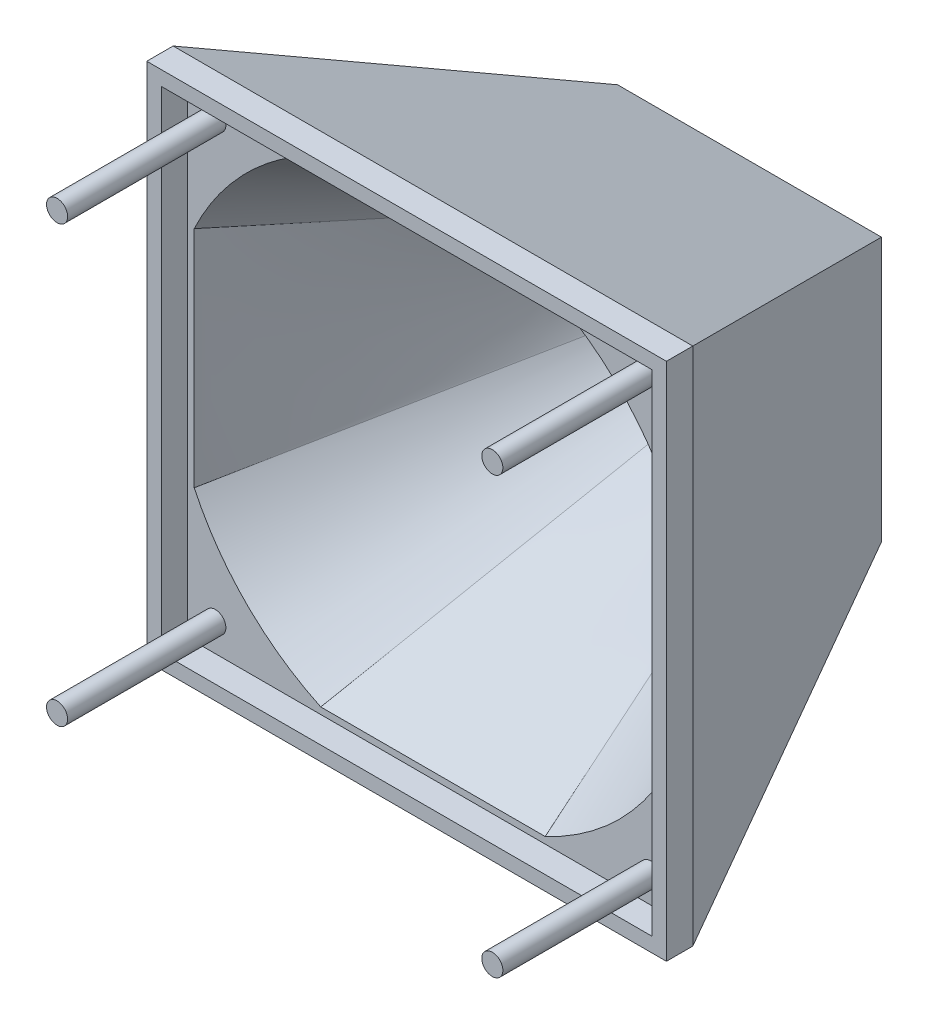
ISO-10303-21;
HEADER;
FILE_DESCRIPTION(('STEP AP214'),'2;1');
FILE_NAME('part.step','',(''),(''),'','','');
FILE_SCHEMA(('AUTOMOTIVE_DESIGN { 1 0 10303 214 1 1 1 1 }'));
ENDSEC;
DATA;
#1=APPLICATION_CONTEXT('core data for automotive mechanical design processes');
#2=APPLICATION_PROTOCOL_DEFINITION('international standard','automotive_design',2000,#1);
#3=PRODUCT_CONTEXT('',#1,'mechanical');
#4=PRODUCT('Part','Part','',(#3));
#5=PRODUCT_RELATED_PRODUCT_CATEGORY('part','',(#4));
#6=PRODUCT_DEFINITION_FORMATION('','',#4);
#7=PRODUCT_DEFINITION_CONTEXT('part definition',#1,'design');
#8=PRODUCT_DEFINITION('design','',#6,#7);
#9=PRODUCT_DEFINITION_SHAPE('','',#8);
#10=(LENGTH_UNIT() NAMED_UNIT(*) SI_UNIT(.MILLI.,.METRE.));
#11=(NAMED_UNIT(*) PLANE_ANGLE_UNIT() SI_UNIT($,.RADIAN.));
#12=(NAMED_UNIT(*) SI_UNIT($,.STERADIAN.) SOLID_ANGLE_UNIT());
#13=UNCERTAINTY_MEASURE_WITH_UNIT(LENGTH_MEASURE(1.E-05),#10,'distance_accuracy_value','');
#14=(GEOMETRIC_REPRESENTATION_CONTEXT(3) GLOBAL_UNCERTAINTY_ASSIGNED_CONTEXT((#13)) GLOBAL_UNIT_ASSIGNED_CONTEXT((#10,
#11,#12)) REPRESENTATION_CONTEXT('',''));
#15=CARTESIAN_POINT('',(0.,0.,0.));
#16=DIRECTION('',(0.,0.,1.));
#17=DIRECTION('',(1.,0.,0.));
#18=AXIS2_PLACEMENT_3D('',#15,#16,#17);
#19=CARTESIAN_POINT('',(49.25,0.,5.));
#20=DIRECTION('',(1.,0.,0.));
#21=DIRECTION('',(0.,1.,0.));
#22=AXIS2_PLACEMENT_3D('',#19,#20,#21);
#23=PLANE('',#22);
#24=DIRECTION('',(0.,-1.,0.));
#25=VECTOR('',#24,1.);
#26=CARTESIAN_POINT('',(49.25,0.,0.));
#27=LINE('',#26,#25);
#28=CARTESIAN_POINT('',(49.25,49.25,0.));
#29=VERTEX_POINT('',#28);
#30=CARTESIAN_POINT('',(49.25,-49.25,0.));
#31=VERTEX_POINT('',#30);
#32=EDGE_CURVE('E708',#29,#31,#27,.T.);
#33=ORIENTED_EDGE('',*,*,#32,.F.);
#34=DIRECTION('',(0.,0.,-1.));
#35=VECTOR('',#34,1.);
#36=CARTESIAN_POINT('',(49.25,49.25,5.));
#37=LINE('',#36,#35);
#38=CARTESIAN_POINT('',(49.25,49.25,5.));
#39=VERTEX_POINT('',#38);
#40=EDGE_CURVE('E12',#39,#29,#37,.T.);
#41=ORIENTED_EDGE('',*,*,#40,.F.);
#42=DIRECTION('',(0.,-1.,0.));
#43=VECTOR('',#42,1.);
#44=CARTESIAN_POINT('',(49.25,0.,5.));
#45=LINE('',#44,#43);
#46=CARTESIAN_POINT('',(49.25,-49.25,5.));
#47=VERTEX_POINT('',#46);
#48=EDGE_CURVE('E695',#39,#47,#45,.T.);
#49=ORIENTED_EDGE('',*,*,#48,.T.);
#50=DIRECTION('',(0.,0.,-1.));
#51=VECTOR('',#50,1.);
#52=CARTESIAN_POINT('',(49.25,-49.25,5.));
#53=LINE('',#52,#51);
#54=EDGE_CURVE('E707',#47,#31,#53,.T.);
#55=ORIENTED_EDGE('',*,*,#54,.T.);
#56=EDGE_LOOP('',(#33,#41,#49,#55));
#57=FACE_BOUND('',#56,.T.);
#58=ADVANCED_FACE('F83',(#57),#23,.T.);
#59=CARTESIAN_POINT('',(0.,49.25,5.));
#60=DIRECTION('',(0.,1.,0.));
#61=DIRECTION('',(0.,0.,1.));
#62=AXIS2_PLACEMENT_3D('',#59,#60,#61);
#63=PLANE('',#62);
#64=DIRECTION('',(1.,0.,0.));
#65=VECTOR('',#64,1.);
#66=CARTESIAN_POINT('',(0.,49.25,0.));
#67=LINE('',#66,#65);
#68=CARTESIAN_POINT('',(-49.25,49.25,0.));
#69=VERTEX_POINT('',#68);
#70=EDGE_CURVE('E710',#69,#29,#67,.T.);
#71=ORIENTED_EDGE('',*,*,#70,.F.);
#72=DIRECTION('',(0.,0.,-1.));
#73=VECTOR('',#72,1.);
#74=CARTESIAN_POINT('',(-49.25,49.25,5.));
#75=LINE('',#74,#73);
#76=CARTESIAN_POINT('',(-49.25,49.25,5.));
#77=VERTEX_POINT('',#76);
#78=EDGE_CURVE('E92',#77,#69,#75,.T.);
#79=ORIENTED_EDGE('',*,*,#78,.F.);
#80=DIRECTION('',(1.,0.,0.));
#81=VECTOR('',#80,1.);
#82=CARTESIAN_POINT('',(0.,49.25,5.));
#83=LINE('',#82,#81);
#84=EDGE_CURVE('E698',#77,#39,#83,.T.);
#85=ORIENTED_EDGE('',*,*,#84,.T.);
#86=ORIENTED_EDGE('',*,*,#40,.T.);
#87=EDGE_LOOP('',(#71,#79,#85,#86));
#88=FACE_BOUND('',#87,.T.);
#89=ADVANCED_FACE('F728',(#88),#63,.T.);
#90=CARTESIAN_POINT('',(-49.25,0.,5.));
#91=DIRECTION('',(1.,0.,0.));
#92=DIRECTION('',(0.,1.,0.));
#93=AXIS2_PLACEMENT_3D('',#90,#91,#92);
#94=PLANE('',#93);
#95=DIRECTION('',(0.,-1.,0.));
#96=VECTOR('',#95,1.);
#97=CARTESIAN_POINT('',(-49.25,0.,0.));
#98=LINE('',#97,#96);
#99=CARTESIAN_POINT('',(-49.25,-49.25,0.));
#100=VERTEX_POINT('',#99);
#101=EDGE_CURVE('E713',#69,#100,#98,.T.);
#102=ORIENTED_EDGE('',*,*,#101,.T.);
#103=DIRECTION('',(0.,0.,-1.));
#104=VECTOR('',#103,1.);
#105=CARTESIAN_POINT('',(-49.25,-49.25,5.));
#106=LINE('',#105,#104);
#107=CARTESIAN_POINT('',(-49.25,-49.25,5.));
#108=VERTEX_POINT('',#107);
#109=EDGE_CURVE('E719',#108,#100,#106,.T.);
#110=ORIENTED_EDGE('',*,*,#109,.F.);
#111=DIRECTION('',(0.,-1.,0.));
#112=VECTOR('',#111,1.);
#113=CARTESIAN_POINT('',(-49.25,0.,5.));
#114=LINE('',#113,#112);
#115=EDGE_CURVE('E702',#77,#108,#114,.T.);
#116=ORIENTED_EDGE('',*,*,#115,.F.);
#117=ORIENTED_EDGE('',*,*,#78,.T.);
#118=EDGE_LOOP('',(#102,#110,#116,#117));
#119=FACE_BOUND('',#118,.T.);
#120=ADVANCED_FACE('F733',(#119),#94,.F.);
#121=CARTESIAN_POINT('',(0.,-49.25,5.));
#122=DIRECTION('',(0.,1.,0.));
#123=DIRECTION('',(0.,0.,1.));
#124=AXIS2_PLACEMENT_3D('',#121,#122,#123);
#125=PLANE('',#124);
#126=DIRECTION('',(1.,0.,0.));
#127=VECTOR('',#126,1.);
#128=CARTESIAN_POINT('',(0.,-49.25,0.));
#129=LINE('',#128,#127);
#130=EDGE_CURVE('E699',#100,#31,#129,.T.);
#131=ORIENTED_EDGE('',*,*,#130,.T.);
#132=ORIENTED_EDGE('',*,*,#54,.F.);
#133=DIRECTION('',(1.,0.,0.));
#134=VECTOR('',#133,1.);
#135=CARTESIAN_POINT('',(0.,-49.25,5.));
#136=LINE('',#135,#134);
#137=EDGE_CURVE('E705',#108,#47,#136,.T.);
#138=ORIENTED_EDGE('',*,*,#137,.F.);
#139=ORIENTED_EDGE('',*,*,#109,.T.);
#140=EDGE_LOOP('',(#131,#132,#138,#139));
#141=FACE_BOUND('',#140,.T.);
#142=ADVANCED_FACE('F752',(#141),#125,.F.);
#143=CARTESIAN_POINT('',(0.,0.,5.));
#144=DIRECTION('',(0.,0.,1.));
#145=DIRECTION('',(1.,0.,0.));
#146=AXIS2_PLACEMENT_3D('',#143,#144,#145);
#147=PLANE('',#146);
#148=DIRECTION('',(-1.,0.,0.));
#149=VECTOR('',#148,1.);
#150=CARTESIAN_POINT('',(46.5,-46.5,5.));
#151=LINE('',#150,#149);
#152=CARTESIAN_POINT('',(46.5,-46.5,5.));
#153=VERTEX_POINT('',#152);
#154=CARTESIAN_POINT('',(-46.5,-46.5,5.));
#155=VERTEX_POINT('',#154);
#156=EDGE_CURVE('E220',#153,#155,#151,.T.);
#157=ORIENTED_EDGE('',*,*,#156,.T.);
#158=DIRECTION('',(0.,-1.,0.));
#159=VECTOR('',#158,1.);
#160=CARTESIAN_POINT('',(-46.5,46.5,5.));
#161=LINE('',#160,#159);
#162=CARTESIAN_POINT('',(-46.5,46.5,5.));
#163=VERTEX_POINT('',#162);
#164=EDGE_CURVE('E211',#163,#155,#161,.T.);
#165=ORIENTED_EDGE('',*,*,#164,.F.);
#166=DIRECTION('',(-1.,0.,0.));
#167=VECTOR('',#166,1.);
#168=CARTESIAN_POINT('',(46.5,46.5,5.));
#169=LINE('',#168,#167);
#170=CARTESIAN_POINT('',(46.5,46.5,5.));
#171=VERTEX_POINT('',#170);
#172=EDGE_CURVE('E219',#171,#163,#169,.T.);
#173=ORIENTED_EDGE('',*,*,#172,.F.);
#174=DIRECTION('',(0.,-1.,0.));
#175=VECTOR('',#174,1.);
#176=CARTESIAN_POINT('',(46.5,46.5,5.));
#177=LINE('',#176,#175);
#178=EDGE_CURVE('E229',#171,#153,#177,.T.);
#179=ORIENTED_EDGE('',*,*,#178,.T.);
#180=EDGE_LOOP('',(#157,#165,#173,#179));
#181=FACE_BOUND('',#180,.T.);
#182=ORIENTED_EDGE('',*,*,#48,.F.);
#183=ORIENTED_EDGE('',*,*,#84,.F.);
#184=ORIENTED_EDGE('',*,*,#115,.T.);
#185=ORIENTED_EDGE('',*,*,#137,.T.);
#186=EDGE_LOOP('',(#182,#183,#184,#185));
#187=FACE_BOUND('',#186,.T.);
#188=ADVANCED_FACE('F231',(#181,#187),#147,.T.);
#189=CARTESIAN_POINT('',(49.25,-49.25,0.));
#190=DIRECTION('',(0.927183854566787,0.,-0.374606593415912));
#191=DIRECTION('',(-0.374606593415912,0.,-0.927183854566787));
#192=AXIS2_PLACEMENT_3D('',#189,#190,#191);
#193=PLANE('',#192);
#194=ORIENTED_EDGE('',*,*,#32,.T.);
#195=DIRECTION('',(0.350800434887317,-0.350800434887317,0.868261544562316));
#196=VECTOR('',#195,1.);
#197=CARTESIAN_POINT('',(49.25,-49.25,0.));
#198=LINE('',#197,#196);
#199=CARTESIAN_POINT('',(25.0084264498906,-25.0084264498906,-60.));
#200=VERTEX_POINT('',#199);
#201=EDGE_CURVE('E493',#200,#31,#198,.T.);
#202=ORIENTED_EDGE('',*,*,#201,.F.);
#203=DIRECTION('',(0.,1.,0.));
#204=VECTOR('',#203,1.);
#205=CARTESIAN_POINT('',(25.0084264498906,0.,-60.));
#206=LINE('',#205,#204);
#207=CARTESIAN_POINT('',(25.0084264498906,25.0084264498906,-60.));
#208=VERTEX_POINT('',#207);
#209=EDGE_CURVE('E686',#208,#200,#206,.F.);
#210=ORIENTED_EDGE('',*,*,#209,.F.);
#211=DIRECTION('',(0.350800434887317,0.350800434887317,0.868261544562316));
#212=VECTOR('',#211,1.);
#213=CARTESIAN_POINT('',(37.1284969059627,37.1284969059626,-30.0017729516968));
#214=LINE('',#213,#212);
#215=EDGE_CURVE('E683',#208,#29,#214,.T.);
#216=ORIENTED_EDGE('',*,*,#215,.T.);
#217=EDGE_LOOP('',(#194,#202,#210,#216));
#218=FACE_BOUND('',#217,.T.);
#219=ADVANCED_FACE('F609',(#218),#193,.T.);
#220=CARTESIAN_POINT('',(49.25,-49.25,0.));
#221=DIRECTION('',(0.,-0.927183854566787,-0.374606593415912));
#222=DIRECTION('',(0.,0.374606593415912,-0.927183854566787));
#223=AXIS2_PLACEMENT_3D('',#220,#221,#222);
#224=PLANE('',#223);
#225=ORIENTED_EDGE('',*,*,#130,.F.);
#226=DIRECTION('',(-0.350800434887317,-0.350800434887317,0.868261544562316));
#227=VECTOR('',#226,1.);
#228=CARTESIAN_POINT('',(-49.25,-49.25,0.));
#229=LINE('',#228,#227);
#230=CARTESIAN_POINT('',(-25.0084264498906,-25.0084264498906,-60.));
#231=VERTEX_POINT('',#230);
#232=EDGE_CURVE('E670',#231,#100,#229,.T.);
#233=ORIENTED_EDGE('',*,*,#232,.F.);
#234=DIRECTION('',(1.,0.,0.));
#235=VECTOR('',#234,1.);
#236=CARTESIAN_POINT('',(0.,-25.0084264498906,-60.));
#237=LINE('',#236,#235);
#238=EDGE_CURVE('E689',#200,#231,#237,.F.);
#239=ORIENTED_EDGE('',*,*,#238,.F.);
#240=ORIENTED_EDGE('',*,*,#201,.T.);
#241=EDGE_LOOP('',(#225,#233,#239,#240));
#242=FACE_BOUND('',#241,.T.);
#243=ADVANCED_FACE('F750',(#242),#224,.T.);
#244=CARTESIAN_POINT('',(-49.25,-49.25,0.));
#245=DIRECTION('',(-0.927183854566787,0.,-0.374606593415912));
#246=DIRECTION('',(-0.374606593415912,0.,0.927183854566787));
#247=AXIS2_PLACEMENT_3D('',#244,#245,#246);
#248=PLANE('',#247);
#249=ORIENTED_EDGE('',*,*,#101,.F.);
#250=DIRECTION('',(-0.350800434887317,0.350800434887317,0.868261544562316));
#251=VECTOR('',#250,1.);
#252=CARTESIAN_POINT('',(-37.1284969059626,37.1284969059626,-30.0017729516968));
#253=LINE('',#252,#251);
#254=CARTESIAN_POINT('',(-25.0084264498906,25.0084264498906,-60.));
#255=VERTEX_POINT('',#254);
#256=EDGE_CURVE('E676',#255,#69,#253,.T.);
#257=ORIENTED_EDGE('',*,*,#256,.F.);
#258=DIRECTION('',(0.,-1.,0.));
#259=VECTOR('',#258,1.);
#260=CARTESIAN_POINT('',(-25.0084264498906,0.,-60.));
#261=LINE('',#260,#259);
#262=EDGE_CURVE('E691',#231,#255,#261,.F.);
#263=ORIENTED_EDGE('',*,*,#262,.F.);
#264=ORIENTED_EDGE('',*,*,#232,.T.);
#265=EDGE_LOOP('',(#249,#257,#263,#264));
#266=FACE_BOUND('',#265,.T.);
#267=ADVANCED_FACE('F746',(#266),#248,.T.);
#268=CARTESIAN_POINT('',(49.25,49.25,0.));
#269=DIRECTION('',(0.,0.927183854566787,-0.374606593415912));
#270=DIRECTION('',(0.,0.374606593415912,0.927183854566787));
#271=AXIS2_PLACEMENT_3D('',#268,#269,#270);
#272=PLANE('',#271);
#273=ORIENTED_EDGE('',*,*,#70,.T.);
#274=ORIENTED_EDGE('',*,*,#215,.F.);
#275=DIRECTION('',(-1.,0.,0.));
#276=VECTOR('',#275,1.);
#277=CARTESIAN_POINT('',(0.,25.0084264498906,-60.));
#278=LINE('',#277,#276);
#279=EDGE_CURVE('E693',#255,#208,#278,.F.);
#280=ORIENTED_EDGE('',*,*,#279,.F.);
#281=ORIENTED_EDGE('',*,*,#256,.T.);
#282=EDGE_LOOP('',(#273,#274,#280,#281));
#283=FACE_BOUND('',#282,.T.);
#284=ADVANCED_FACE('F608',(#283),#272,.T.);
#285=CARTESIAN_POINT('',(0.,0.,-60.));
#286=DIRECTION('',(0.,0.,1.));
#287=DIRECTION('',(1.,0.,0.));
#288=AXIS2_PLACEMENT_3D('',#285,#286,#287);
#289=PLANE('',#288);
#290=CARTESIAN_POINT('',(0.,0.,-60.));
#291=DIRECTION('',(0.,0.,-1.));
#292=DIRECTION('',(-1.,0.,0.));
#293=AXIS2_PLACEMENT_3D('',#290,#291,#292);
#294=CIRCLE('',#293,20.5);
#295=CARTESIAN_POINT('',(18.5525,-8.72093709127638,-60.));
#296=VERTEX_POINT('',#295);
#297=CARTESIAN_POINT('',(8.72093709127634,-18.5525,-60.));
#298=VERTEX_POINT('',#297);
#299=EDGE_CURVE('E509',#296,#298,#294,.T.);
#300=ORIENTED_EDGE('',*,*,#299,.F.);
#301=CARTESIAN_POINT('',(18.5525,8.72093709127638,-60.));
#302=VERTEX_POINT('',#301);
#303=EDGE_CURVE('E506',#302,#296,#294,.T.);
#304=ORIENTED_EDGE('',*,*,#303,.F.);
#305=CARTESIAN_POINT('',(8.72093709127638,18.5525,-60.));
#306=VERTEX_POINT('',#305);
#307=EDGE_CURVE('E502',#306,#302,#294,.T.);
#308=ORIENTED_EDGE('',*,*,#307,.F.);
#309=CARTESIAN_POINT('',(-8.72093709127638,18.5525,-60.));
#310=VERTEX_POINT('',#309);
#311=EDGE_CURVE('E86',#310,#306,#294,.T.);
#312=ORIENTED_EDGE('',*,*,#311,.F.);
#313=CARTESIAN_POINT('',(-18.5525,8.72093709127638,-60.));
#314=VERTEX_POINT('',#313);
#315=EDGE_CURVE('E513',#314,#310,#294,.T.);
#316=ORIENTED_EDGE('',*,*,#315,.F.);
#317=CARTESIAN_POINT('',(-18.5525,-8.72093709127638,-60.));
#318=VERTEX_POINT('',#317);
#319=EDGE_CURVE('E395',#318,#314,#294,.T.);
#320=ORIENTED_EDGE('',*,*,#319,.F.);
#321=CARTESIAN_POINT('',(-8.72093709127637,-18.5525,-60.));
#322=VERTEX_POINT('',#321);
#323=EDGE_CURVE('E381',#322,#318,#294,.T.);
#324=ORIENTED_EDGE('',*,*,#323,.F.);
#325=EDGE_CURVE('E512',#298,#322,#294,.T.);
#326=ORIENTED_EDGE('',*,*,#325,.F.);
#327=EDGE_LOOP('',(#300,#304,#308,#312,#316,#320,#324,#326));
#328=FACE_BOUND('',#327,.T.);
#329=ORIENTED_EDGE('',*,*,#209,.T.);
#330=ORIENTED_EDGE('',*,*,#238,.T.);
#331=ORIENTED_EDGE('',*,*,#262,.T.);
#332=ORIENTED_EDGE('',*,*,#279,.T.);
#333=EDGE_LOOP('',(#329,#330,#331,#332));
#334=FACE_BOUND('',#333,.T.);
#335=ADVANCED_FACE('F560',(#328,#334),#289,.F.);
#336=CARTESIAN_POINT('',(0.,0.,0.));
#337=DIRECTION('',(0.,0.,1.));
#338=DIRECTION('',(1.,0.,0.));
#339=AXIS2_PLACEMENT_3D('',#336,#337,#338);
#340=CONICAL_SURFACE('',#339,50.,0.456958745547133);
#341=DIRECTION('',(-0.187700488415992,0.399304945660151,-0.897398510707334));
#342=VECTOR('',#341,1.);
#343=CARTESIAN_POINT('',(21.2705782714057,-45.25,0.));
#344=LINE('',#343,#342);
#345=CARTESIAN_POINT('',(21.2705782714058,-45.25,0.));
#346=VERTEX_POINT('',#345);
#347=EDGE_CURVE('E252',#346,#298,#344,.T.);
#348=ORIENTED_EDGE('',*,*,#347,.F.);
#349=CARTESIAN_POINT('',(0.,0.,0.));
#350=DIRECTION('',(0.,0.,1.));
#351=DIRECTION('',(0.425411565428114,-0.905000000000001,0.));
#352=AXIS2_PLACEMENT_3D('',#349,#350,#351);
#353=CIRCLE('',#352,50.);
#354=CARTESIAN_POINT('',(45.25,-21.2705782714058,0.));
#355=VERTEX_POINT('',#354);
#356=EDGE_CURVE('E318',#346,#355,#353,.T.);
#357=ORIENTED_EDGE('',*,*,#356,.T.);
#358=DIRECTION('',(-0.399304945660151,0.187700488415993,-0.897398510707334));
#359=VECTOR('',#358,1.);
#360=CARTESIAN_POINT('',(45.25,-21.2705782714058,0.));
#361=LINE('',#360,#359);
#362=EDGE_CURVE('E534',#355,#296,#361,.T.);
#363=ORIENTED_EDGE('',*,*,#362,.T.);
#364=ORIENTED_EDGE('',*,*,#299,.T.);
#365=EDGE_LOOP('',(#348,#357,#363,#364));
#366=FACE_BOUND('',#365,.T.);
#367=ADVANCED_FACE('F551',(#366),#340,.F.);
#368=CARTESIAN_POINT('',(45.25,21.2705782714058,0.));
#369=CARTESIAN_POINT('',(18.5525,8.72093709127638,-60.));
#370=CARTESIAN_POINT('',(45.25,17.7254818928382,0.));
#371=CARTESIAN_POINT('',(19.17083125,7.40552908000886,-60.));
#372=CARTESIAN_POINT('',(45.25,14.1803855142705,0.));
#373=CARTESIAN_POINT('',(19.6627100248693,5.99161370507068,-60.));
#374=CARTESIAN_POINT('',(45.25,7.09019275713526,0.));
#375=CARTESIAN_POINT('',(20.3275686530309,3.05148373241617,-60.));
#376=CARTESIAN_POINT('',(45.25,3.54509637856762,0.));
#377=CARTESIAN_POINT('',(20.5,1.52597324431783,-60.));
#378=CARTESIAN_POINT('',(45.25,-3.54509637856764,0.));
#379=CARTESIAN_POINT('',(20.5,-1.52597324431782,-60.));
#380=CARTESIAN_POINT('',(45.25,-7.09019275713528,0.));
#381=CARTESIAN_POINT('',(20.3275686530309,-3.05148373241617,-60.));
#382=CARTESIAN_POINT('',(45.25,-14.1803855142705,0.));
#383=CARTESIAN_POINT('',(19.6627100248693,-5.99161370507067,-60.));
#384=CARTESIAN_POINT('',(45.25,-17.7254818928382,0.));
#385=CARTESIAN_POINT('',(19.17083125,-7.40552908000886,-60.));
#386=CARTESIAN_POINT('',(45.25,-21.2705782714058,0.));
#387=CARTESIAN_POINT('',(18.5525,-8.72093709127638,-60.));
#388=B_SPLINE_SURFACE_WITH_KNOTS('',3,1,((#368,#369),(#370,#371),(#372,#373),(#374,#375),(#376,
#377),(#378,#379),(#380,#381),(#382,#383),(#384,#385),(#386,#387)),.UNSPECIFIED.,.F.,.F.,.F.,(4,
2,2,2,4),(2,2),(0.,0.25,0.5,0.75,1.),(0.,1.),.UNSPECIFIED.);
#389=CARTESIAN_POINT('',(45.25,-21.2705782714058,0.));
#390=CARTESIAN_POINT('',(45.25,-17.7254818928382,0.));
#391=CARTESIAN_POINT('',(45.25,-14.1803855142705,0.));
#392=CARTESIAN_POINT('',(45.25,-7.09019275713528,0.));
#393=CARTESIAN_POINT('',(45.25,-3.54509637856764,0.));
#394=CARTESIAN_POINT('',(45.25,3.54509637856762,0.));
#395=CARTESIAN_POINT('',(45.25,7.09019275713526,0.));
#396=CARTESIAN_POINT('',(45.25,14.1803855142705,0.));
#397=CARTESIAN_POINT('',(45.25,17.7254818928382,0.));
#398=CARTESIAN_POINT('',(45.25,21.2705782714058,0.));
#399=B_SPLINE_CURVE_WITH_KNOTS('',3,(#389,#390,#391,#392,#393,#394,#395,#396,#397,#398),
.UNSPECIFIED.,.F.,.F.,(4,2,2,2,4),(0.,0.25,0.5,0.75,1.),.UNSPECIFIED.);
#400=CARTESIAN_POINT('',(45.25,21.2705782714058,0.));
#401=VERTEX_POINT('',#400);
#402=EDGE_CURVE('E530',#355,#401,#399,.T.);
#403=DIRECTION('',(-0.399304945660151,-0.187700488415993,-0.897398510707334));
#404=VECTOR('',#403,1.);
#405=CARTESIAN_POINT('',(45.25,21.2705782714058,0.));
#406=LINE('',#405,#404);
#407=EDGE_CURVE('E515',#401,#302,#406,.T.);
#408=ORIENTED_EDGE('',*,*,#402,.T.);
#409=ORIENTED_EDGE('',*,*,#407,.T.);
#410=ORIENTED_EDGE('',*,*,#303,.T.);
#411=ORIENTED_EDGE('',*,*,#362,.F.);
#412=EDGE_LOOP('',(#408,#409,#410,#411));
#413=FACE_BOUND('',#412,.T.);
#414=ADVANCED_FACE('F352',(#413),#388,.F.);
#415=CARTESIAN_POINT('',(21.2705782714058,-45.25,0.));
#416=CARTESIAN_POINT('',(8.72093709127637,-18.5525,-60.));
#417=CARTESIAN_POINT('',(17.7254818928382,-45.25,0.));
#418=CARTESIAN_POINT('',(7.40552908000885,-19.17083125,-60.));
#419=CARTESIAN_POINT('',(14.1803855142705,-45.25,0.));
#420=CARTESIAN_POINT('',(5.99161370507067,-19.6627100248693,-60.));
#421=CARTESIAN_POINT('',(7.09019275713526,-45.25,0.));
#422=CARTESIAN_POINT('',(3.05148373241617,-20.3275686530309,-60.));
#423=CARTESIAN_POINT('',(3.54509637856762,-45.25,0.));
#424=CARTESIAN_POINT('',(1.52597324431783,-20.5,-60.));
#425=CARTESIAN_POINT('',(-3.54509637856764,-45.25,0.));
#426=CARTESIAN_POINT('',(-1.52597324431782,-20.5,-60.));
#427=CARTESIAN_POINT('',(-7.09019275713528,-45.25,0.));
#428=CARTESIAN_POINT('',(-3.05148373241616,-20.3275686530309,-60.));
#429=CARTESIAN_POINT('',(-14.1803855142705,-45.25,0.));
#430=CARTESIAN_POINT('',(-5.99161370507067,-19.6627100248693,-60.));
#431=CARTESIAN_POINT('',(-17.7254818928382,-45.25,0.));
#432=CARTESIAN_POINT('',(-7.40552908000885,-19.17083125,-60.));
#433=CARTESIAN_POINT('',(-21.2705782714058,-45.25,0.));
#434=CARTESIAN_POINT('',(-8.72093709127637,-18.5525,-60.));
#435=B_SPLINE_SURFACE_WITH_KNOTS('',3,1,((#415,#416),(#417,#418),(#419,#420),(#421,#422),(#423,
#424),(#425,#426),(#427,#428),(#429,#430),(#431,#432),(#433,#434)),.UNSPECIFIED.,.F.,.F.,.F.,(4,
2,2,2,4),(2,2),(0.,0.25,0.5,0.75,1.),(0.,1.),.UNSPECIFIED.);
#436=CARTESIAN_POINT('',(-21.2705782714058,-45.25,0.));
#437=CARTESIAN_POINT('',(-17.7254818928382,-45.25,0.));
#438=CARTESIAN_POINT('',(-14.1803855142705,-45.25,0.));
#439=CARTESIAN_POINT('',(-7.09019275713528,-45.25,0.));
#440=CARTESIAN_POINT('',(-3.54509637856764,-45.25,0.));
#441=CARTESIAN_POINT('',(3.54509637856762,-45.25,0.));
#442=CARTESIAN_POINT('',(7.09019275713526,-45.25,0.));
#443=CARTESIAN_POINT('',(14.1803855142705,-45.25,0.));
#444=CARTESIAN_POINT('',(17.7254818928382,-45.25,0.));
#445=CARTESIAN_POINT('',(21.2705782714058,-45.25,0.));
#446=B_SPLINE_CURVE_WITH_KNOTS('',3,(#436,#437,#438,#439,#440,#441,#442,#443,#444,#445),
.UNSPECIFIED.,.F.,.F.,(4,2,2,2,4),(0.,0.25,0.5,0.75,1.),.UNSPECIFIED.);
#447=CARTESIAN_POINT('',(-21.2705782714058,-45.25,0.));
#448=VERTEX_POINT('',#447);
#449=EDGE_CURVE('E332',#448,#346,#446,.T.);
#450=DIRECTION('',(0.187700488415993,0.399304945660151,-0.897398510707334));
#451=VECTOR('',#450,1.);
#452=CARTESIAN_POINT('',(-14.9957576813411,-31.90125,-30.));
#453=LINE('',#452,#451);
#454=EDGE_CURVE('E542',#448,#322,#453,.T.);
#455=ORIENTED_EDGE('',*,*,#449,.T.);
#456=ORIENTED_EDGE('',*,*,#347,.T.);
#457=ORIENTED_EDGE('',*,*,#325,.T.);
#458=ORIENTED_EDGE('',*,*,#454,.F.);
#459=EDGE_LOOP('',(#455,#456,#457,#458));
#460=FACE_BOUND('',#459,.T.);
#461=ADVANCED_FACE('F339',(#460),#435,.F.);
#462=CARTESIAN_POINT('',(0.,0.,0.));
#463=DIRECTION('',(0.,0.,1.));
#464=DIRECTION('',(1.,0.,0.));
#465=AXIS2_PLACEMENT_3D('',#462,#463,#464);
#466=CONICAL_SURFACE('',#465,50.,0.456958745547133);
#467=DIRECTION('',(0.399304945660151,0.187700488415993,-0.897398510707334));
#468=VECTOR('',#467,1.);
#469=CARTESIAN_POINT('',(-45.25,-21.2705782714058,0.));
#470=LINE('',#469,#468);
#471=CARTESIAN_POINT('',(-45.25,-21.2705782714058,0.));
#472=VERTEX_POINT('',#471);
#473=EDGE_CURVE('E436',#472,#318,#470,.T.);
#474=ORIENTED_EDGE('',*,*,#473,.F.);
#475=CARTESIAN_POINT('',(-21.2705782714058,-45.25,0.));
#476=CARTESIAN_POINT('',(-25.1945124749243,-43.4054839865683,0.));
#477=CARTESIAN_POINT('',(-28.741950302119,-40.913326592084,0.));
#478=CARTESIAN_POINT('',(-32.2900208828328,-38.420724673569,0.));
#479=CARTESIAN_POINT('',(-35.3553390593274,-35.3553390593274,0.));
#480=CARTESIAN_POINT('',(-38.4214172322668,-32.2891934319209,0.));
#481=CARTESIAN_POINT('',(-40.913326592084,-28.7419503021189,0.));
#482=CARTESIAN_POINT('',(-43.4057090082495,-25.1940337746771,0.));
#483=CARTESIAN_POINT('',(-45.25,-21.2705782714058,0.));
#484=B_SPLINE_CURVE_WITH_KNOTS('',2,(#475,#476,#477,#478,#479,#480,#481,#482,#483),
.UNSPECIFIED.,.F.,.F.,(3,2,2,2,3),(0.,0.25,0.5,0.75,1.),.UNSPECIFIED.);
#485=EDGE_CURVE('E652',#448,#472,#484,.T.);
#486=ORIENTED_EDGE('',*,*,#485,.F.);
#487=ORIENTED_EDGE('',*,*,#454,.T.);
#488=ORIENTED_EDGE('',*,*,#323,.T.);
#489=EDGE_LOOP('',(#474,#486,#487,#488));
#490=FACE_BOUND('',#489,.T.);
#491=ADVANCED_FACE('F351',(#490),#466,.F.);
#492=CARTESIAN_POINT('',(-45.25,-21.2705782714058,0.));
#493=CARTESIAN_POINT('',(-18.5525,-8.72093709127637,-60.));
#494=CARTESIAN_POINT('',(-45.25,-17.7254818928382,0.));
#495=CARTESIAN_POINT('',(-19.17083125,-7.40552908000885,-60.));
#496=CARTESIAN_POINT('',(-45.25,-14.1803855142705,0.));
#497=CARTESIAN_POINT('',(-19.6627100248693,-5.99161370507067,-60.));
#498=CARTESIAN_POINT('',(-45.25,-7.09019275713526,0.));
#499=CARTESIAN_POINT('',(-20.3275686530309,-3.05148373241617,-60.));
#500=CARTESIAN_POINT('',(-45.25,-3.54509637856762,0.));
#501=CARTESIAN_POINT('',(-20.5,-1.52597324431782,-60.));
#502=CARTESIAN_POINT('',(-45.25,3.54509637856764,0.));
#503=CARTESIAN_POINT('',(-20.5,1.52597324431783,-60.));
#504=CARTESIAN_POINT('',(-45.25,7.09019275713528,0.));
#505=CARTESIAN_POINT('',(-20.3275686530309,3.05148373241618,-60.));
#506=CARTESIAN_POINT('',(-45.25,14.1803855142705,0.));
#507=CARTESIAN_POINT('',(-19.6627100248693,5.99161370507068,-60.));
#508=CARTESIAN_POINT('',(-45.25,17.7254818928382,0.));
#509=CARTESIAN_POINT('',(-19.17083125,7.40552908000886,-60.));
#510=CARTESIAN_POINT('',(-45.25,21.2705782714058,0.));
#511=CARTESIAN_POINT('',(-18.5525,8.72093709127638,-60.));
#512=B_SPLINE_SURFACE_WITH_KNOTS('',3,1,((#492,#493),(#494,#495),(#496,#497),(#498,#499),(#500,
#501),(#502,#503),(#504,#505),(#506,#507),(#508,#509),(#510,#511)),.UNSPECIFIED.,.F.,.F.,.F.,(4,
2,2,2,4),(2,2),(0.,0.25,0.5,0.75,1.),(0.,1.),.UNSPECIFIED.);
#513=CARTESIAN_POINT('',(-45.25,21.2705782714058,0.));
#514=CARTESIAN_POINT('',(-45.25,17.7254818928382,0.));
#515=CARTESIAN_POINT('',(-45.25,14.1803855142705,0.));
#516=CARTESIAN_POINT('',(-45.25,7.09019275713528,0.));
#517=CARTESIAN_POINT('',(-45.25,3.54509637856764,0.));
#518=CARTESIAN_POINT('',(-45.25,-3.54509637856762,0.));
#519=CARTESIAN_POINT('',(-45.25,-7.09019275713526,0.));
#520=CARTESIAN_POINT('',(-45.25,-14.1803855142705,0.));
#521=CARTESIAN_POINT('',(-45.25,-17.7254818928382,0.));
#522=CARTESIAN_POINT('',(-45.25,-21.2705782714058,0.));
#523=B_SPLINE_CURVE_WITH_KNOTS('',3,(#513,#514,#515,#516,#517,#518,#519,#520,#521,#522),
.UNSPECIFIED.,.F.,.F.,(4,2,2,2,4),(0.,0.25,0.5,0.75,1.),.UNSPECIFIED.);
#524=CARTESIAN_POINT('',(-45.25,21.2705782714058,0.));
#525=VERTEX_POINT('',#524);
#526=EDGE_CURVE('E668',#472,#525,#523,.F.);
#527=DIRECTION('',(0.399304945660151,-0.187700488415993,-0.897398510707334));
#528=VECTOR('',#527,1.);
#529=CARTESIAN_POINT('',(-31.90125,14.9957576813411,-30.));
#530=LINE('',#529,#528);
#531=EDGE_CURVE('E428',#525,#314,#530,.T.);
#532=ORIENTED_EDGE('',*,*,#526,.F.);
#533=ORIENTED_EDGE('',*,*,#473,.T.);
#534=ORIENTED_EDGE('',*,*,#319,.T.);
#535=ORIENTED_EDGE('',*,*,#531,.F.);
#536=EDGE_LOOP('',(#532,#533,#534,#535));
#537=FACE_BOUND('',#536,.T.);
#538=ADVANCED_FACE('F401',(#537),#512,.F.);
#539=CARTESIAN_POINT('',(0.,0.,0.));
#540=DIRECTION('',(0.,0.,1.));
#541=DIRECTION('',(1.,0.,0.));
#542=AXIS2_PLACEMENT_3D('',#539,#540,#541);
#543=CONICAL_SURFACE('',#542,50.,0.456958745547133);
#544=DIRECTION('',(0.187700488415993,-0.399304945660151,-0.897398510707334));
#545=VECTOR('',#544,1.);
#546=CARTESIAN_POINT('',(-21.2705782714058,45.25,0.));
#547=LINE('',#546,#545);
#548=CARTESIAN_POINT('',(-21.2705782714058,45.25,0.));
#549=VERTEX_POINT('',#548);
#550=EDGE_CURVE('E435',#549,#310,#547,.T.);
#551=ORIENTED_EDGE('',*,*,#550,.F.);
#552=CARTESIAN_POINT('',(-45.25,21.2705782714058,0.));
#553=CARTESIAN_POINT('',(-43.4054732726048,25.1945352672923,0.));
#554=CARTESIAN_POINT('',(-40.913326592084,28.741950302119,0.));
#555=CARTESIAN_POINT('',(-38.420706860571,32.2900386954662,0.));
#556=CARTESIAN_POINT('',(-35.3553390593274,35.3553390593274,0.));
#557=CARTESIAN_POINT('',(-32.2891934317966,38.4214172323637,0.));
#558=CARTESIAN_POINT('',(-28.7419503021189,40.913326592084,0.));
#559=CARTESIAN_POINT('',(-25.1940337746357,43.4057090082689,0.));
#560=CARTESIAN_POINT('',(-21.2705782714058,45.25,0.));
#561=B_SPLINE_CURVE_WITH_KNOTS('',2,(#552,#553,#554,#555,#556,#557,#558,#559,#560),
.UNSPECIFIED.,.F.,.F.,(3,2,2,2,3),(0.,0.25,0.5,0.75,1.),.UNSPECIFIED.);
#562=EDGE_CURVE('E443',#525,#549,#561,.T.);
#563=ORIENTED_EDGE('',*,*,#562,.F.);
#564=ORIENTED_EDGE('',*,*,#531,.T.);
#565=ORIENTED_EDGE('',*,*,#315,.T.);
#566=EDGE_LOOP('',(#551,#563,#564,#565));
#567=FACE_BOUND('',#566,.T.);
#568=ADVANCED_FACE('F412',(#567),#543,.F.);
#569=CARTESIAN_POINT('',(-21.2705782714058,45.25,0.));
#570=CARTESIAN_POINT('',(-8.72093709127638,18.5525,-60.));
#571=CARTESIAN_POINT('',(-17.7254818928382,45.25,0.));
#572=CARTESIAN_POINT('',(-7.40552908000886,19.17083125,-60.));
#573=CARTESIAN_POINT('',(-14.1803855142705,45.25,0.));
#574=CARTESIAN_POINT('',(-5.99161370507068,19.6627100248693,-60.));
#575=CARTESIAN_POINT('',(-7.09019275713526,45.25,0.));
#576=CARTESIAN_POINT('',(-3.05148373241617,20.3275686530309,-60.));
#577=CARTESIAN_POINT('',(-3.54509637856762,45.25,0.));
#578=CARTESIAN_POINT('',(-1.52597324431783,20.5,-60.));
#579=CARTESIAN_POINT('',(3.54509637856764,45.25,0.));
#580=CARTESIAN_POINT('',(1.52597324431782,20.5,-60.));
#581=CARTESIAN_POINT('',(7.09019275713528,45.25,0.));
#582=CARTESIAN_POINT('',(3.05148373241617,20.3275686530309,-60.));
#583=CARTESIAN_POINT('',(14.1803855142705,45.25,0.));
#584=CARTESIAN_POINT('',(5.99161370507067,19.6627100248693,-60.));
#585=CARTESIAN_POINT('',(17.7254818928382,45.25,0.));
#586=CARTESIAN_POINT('',(7.40552908000886,19.17083125,-60.));
#587=CARTESIAN_POINT('',(21.2705782714058,45.25,0.));
#588=CARTESIAN_POINT('',(8.72093709127638,18.5525,-60.));
#589=B_SPLINE_SURFACE_WITH_KNOTS('',3,1,((#569,#570),(#571,#572),(#573,#574),(#575,#576),(#577,
#578),(#579,#580),(#581,#582),(#583,#584),(#585,#586),(#587,#588)),.UNSPECIFIED.,.F.,.F.,.F.,(4,
2,2,2,4),(2,2),(0.,0.25,0.5,0.75,1.),(0.,1.),.UNSPECIFIED.);
#590=CARTESIAN_POINT('',(21.2705782714058,45.25,0.));
#591=CARTESIAN_POINT('',(17.7254818928382,45.25,0.));
#592=CARTESIAN_POINT('',(14.1803855142705,45.25,0.));
#593=CARTESIAN_POINT('',(7.09019275713528,45.25,0.));
#594=CARTESIAN_POINT('',(3.54509637856764,45.25,0.));
#595=CARTESIAN_POINT('',(-3.54509637856762,45.25,0.));
#596=CARTESIAN_POINT('',(-7.09019275713526,45.25,0.));
#597=CARTESIAN_POINT('',(-14.1803855142705,45.25,0.));
#598=CARTESIAN_POINT('',(-17.7254818928382,45.25,0.));
#599=CARTESIAN_POINT('',(-21.2705782714058,45.25,0.));
#600=B_SPLINE_CURVE_WITH_KNOTS('',3,(#590,#591,#592,#593,#594,#595,#596,#597,#598,#599),
.UNSPECIFIED.,.F.,.F.,(4,2,2,2,4),(0.,0.25,0.5,0.75,1.),.UNSPECIFIED.);
#601=CARTESIAN_POINT('',(21.2705782714058,45.25,0.));
#602=VERTEX_POINT('',#601);
#603=EDGE_CURVE('E458',#549,#602,#600,.F.);
#604=DIRECTION('',(-0.187700488415993,-0.399304945660151,-0.897398510707334));
#605=VECTOR('',#604,1.);
#606=CARTESIAN_POINT('',(14.9957576813411,31.90125,-30.));
#607=LINE('',#606,#605);
#608=EDGE_CURVE('E453',#602,#306,#607,.T.);
#609=ORIENTED_EDGE('',*,*,#603,.F.);
#610=ORIENTED_EDGE('',*,*,#550,.T.);
#611=ORIENTED_EDGE('',*,*,#311,.T.);
#612=ORIENTED_EDGE('',*,*,#608,.F.);
#613=EDGE_LOOP('',(#609,#610,#611,#612));
#614=FACE_BOUND('',#613,.T.);
#615=ADVANCED_FACE('F463',(#614),#589,.F.);
#616=CARTESIAN_POINT('',(0.,0.,0.));
#617=DIRECTION('',(0.,0.,1.));
#618=DIRECTION('',(1.,0.,0.));
#619=AXIS2_PLACEMENT_3D('',#616,#617,#618);
#620=CONICAL_SURFACE('',#619,50.,0.456958745547133);
#621=ORIENTED_EDGE('',*,*,#407,.F.);
#622=CARTESIAN_POINT('',(21.2705782714058,45.25,0.));
#623=CARTESIAN_POINT('',(25.1945352671843,43.4054732726555,0.));
#624=CARTESIAN_POINT('',(28.7419503021189,40.913326592084,0.));
#625=CARTESIAN_POINT('',(32.2900386952899,38.4207068607199,0.));
#626=CARTESIAN_POINT('',(35.3553390593274,35.3553390593274,0.));
#627=CARTESIAN_POINT('',(38.4214172321673,32.2891934320204,0.));
#628=CARTESIAN_POINT('',(40.913326592084,28.7419503021189,0.));
#629=CARTESIAN_POINT('',(43.4057090081896,25.1940337748045,0.));
#630=CARTESIAN_POINT('',(45.25,21.2705782714058,0.));
#631=B_SPLINE_CURVE_WITH_KNOTS('',2,(#622,#623,#624,#625,#626,#627,#628,#629,#630),
.UNSPECIFIED.,.F.,.F.,(3,2,2,2,3),(0.,0.25,0.5,0.75,1.),.UNSPECIFIED.);
#632=EDGE_CURVE('E259',#602,#401,#631,.T.);
#633=ORIENTED_EDGE('',*,*,#632,.F.);
#634=ORIENTED_EDGE('',*,*,#608,.T.);
#635=ORIENTED_EDGE('',*,*,#307,.T.);
#636=EDGE_LOOP('',(#621,#633,#634,#635));
#637=FACE_BOUND('',#636,.T.);
#638=ADVANCED_FACE('F474',(#637),#620,.F.);
#639=CARTESIAN_POINT('',(46.5,-46.5,5.));
#640=DIRECTION('',(0.,-1.,0.));
#641=DIRECTION('',(1.,0.,0.));
#642=AXIS2_PLACEMENT_3D('',#639,#640,#641);
#643=PLANE('',#642);
#644=DIRECTION('',(-1.,0.,0.));
#645=VECTOR('',#644,1.);
#646=CARTESIAN_POINT('',(46.5,-46.5,0.));
#647=LINE('',#646,#645);
#648=CARTESIAN_POINT('',(46.5,-46.5,0.));
#649=VERTEX_POINT('',#648);
#650=CARTESIAN_POINT('',(-46.5,-46.5,0.));
#651=VERTEX_POINT('',#650);
#652=EDGE_CURVE('E228',#649,#651,#647,.T.);
#653=ORIENTED_EDGE('',*,*,#652,.T.);
#654=DIRECTION('',(0.,0.,-1.));
#655=VECTOR('',#654,1.);
#656=CARTESIAN_POINT('',(-46.5,-46.5,5.));
#657=LINE('',#656,#655);
#658=EDGE_CURVE('E214',#155,#651,#657,.T.);
#659=ORIENTED_EDGE('',*,*,#658,.F.);
#660=ORIENTED_EDGE('',*,*,#156,.F.);
#661=DIRECTION('',(0.,0.,-1.));
#662=VECTOR('',#661,1.);
#663=CARTESIAN_POINT('',(46.5,-46.5,5.));
#664=LINE('',#663,#662);
#665=EDGE_CURVE('E250',#153,#649,#664,.T.);
#666=ORIENTED_EDGE('',*,*,#665,.T.);
#667=EDGE_LOOP('',(#653,#659,#660,#666));
#668=FACE_BOUND('',#667,.T.);
#669=ADVANCED_FACE('F225',(#668),#643,.F.);
#670=CARTESIAN_POINT('',(46.5,46.5,5.));
#671=DIRECTION('',(1.,0.,0.));
#672=DIRECTION('',(0.,0.,-1.));
#673=AXIS2_PLACEMENT_3D('',#670,#671,#672);
#674=PLANE('',#673);
#675=DIRECTION('',(0.,-1.,0.));
#676=VECTOR('',#675,1.);
#677=CARTESIAN_POINT('',(46.5,46.5,0.));
#678=LINE('',#677,#676);
#679=CARTESIAN_POINT('',(46.5,46.5,0.));
#680=VERTEX_POINT('',#679);
#681=EDGE_CURVE('E234',#680,#649,#678,.T.);
#682=ORIENTED_EDGE('',*,*,#681,.T.);
#683=ORIENTED_EDGE('',*,*,#665,.F.);
#684=ORIENTED_EDGE('',*,*,#178,.F.);
#685=DIRECTION('',(0.,0.,-1.));
#686=VECTOR('',#685,1.);
#687=CARTESIAN_POINT('',(46.5,46.5,5.));
#688=LINE('',#687,#686);
#689=EDGE_CURVE('E253',#171,#680,#688,.T.);
#690=ORIENTED_EDGE('',*,*,#689,.T.);
#691=EDGE_LOOP('',(#682,#683,#684,#690));
#692=FACE_BOUND('',#691,.T.);
#693=ADVANCED_FACE('F279',(#692),#674,.F.);
#694=CARTESIAN_POINT('',(46.5,46.5,5.));
#695=DIRECTION('',(0.,-1.,0.));
#696=DIRECTION('',(1.,0.,0.));
#697=AXIS2_PLACEMENT_3D('',#694,#695,#696);
#698=PLANE('',#697);
#699=DIRECTION('',(-1.,0.,0.));
#700=VECTOR('',#699,1.);
#701=CARTESIAN_POINT('',(46.5,46.5,0.));
#702=LINE('',#701,#700);
#703=CARTESIAN_POINT('',(-46.5,46.5,0.));
#704=VERTEX_POINT('',#703);
#705=EDGE_CURVE('E237',#680,#704,#702,.T.);
#706=ORIENTED_EDGE('',*,*,#705,.F.);
#707=ORIENTED_EDGE('',*,*,#689,.F.);
#708=ORIENTED_EDGE('',*,*,#172,.T.);
#709=DIRECTION('',(0.,0.,-1.));
#710=VECTOR('',#709,1.);
#711=CARTESIAN_POINT('',(-46.5,46.5,5.));
#712=LINE('',#711,#710);
#713=EDGE_CURVE('E100',#163,#704,#712,.T.);
#714=ORIENTED_EDGE('',*,*,#713,.T.);
#715=EDGE_LOOP('',(#706,#707,#708,#714));
#716=FACE_BOUND('',#715,.T.);
#717=ADVANCED_FACE('F876',(#716),#698,.T.);
#718=CARTESIAN_POINT('',(-46.5,46.5,5.));
#719=DIRECTION('',(1.,0.,0.));
#720=DIRECTION('',(0.,1.,0.));
#721=AXIS2_PLACEMENT_3D('',#718,#719,#720);
#722=PLANE('',#721);
#723=DIRECTION('',(0.,-1.,0.));
#724=VECTOR('',#723,1.);
#725=CARTESIAN_POINT('',(-46.5,46.5,0.));
#726=LINE('',#725,#724);
#727=EDGE_CURVE('E246',#704,#651,#726,.T.);
#728=ORIENTED_EDGE('',*,*,#727,.F.);
#729=ORIENTED_EDGE('',*,*,#713,.F.);
#730=ORIENTED_EDGE('',*,*,#164,.T.);
#731=ORIENTED_EDGE('',*,*,#658,.T.);
#732=EDGE_LOOP('',(#728,#729,#730,#731));
#733=FACE_BOUND('',#732,.T.);
#734=ADVANCED_FACE('F213',(#733),#722,.T.);
#735=CARTESIAN_POINT('',(0.,0.,0.));
#736=DIRECTION('',(0.,0.,1.));
#737=DIRECTION('',(1.,0.,0.));
#738=AXIS2_PLACEMENT_3D('',#735,#736,#737);
#739=PLANE('',#738);
#740=CARTESIAN_POINT('',(-41.25,41.25,0.));
#741=DIRECTION('',(0.,0.,1.));
#742=DIRECTION('',(1.,0.,0.));
#743=AXIS2_PLACEMENT_3D('',#740,#741,#742);
#744=CIRCLE('',#743,2.);
#745=CARTESIAN_POINT('',(-39.25,41.25,0.));
#746=VERTEX_POINT('',#745);
#747=EDGE_CURVE('E982',#746,#746,#744,.T.);
#748=ORIENTED_EDGE('',*,*,#747,.F.);
#749=EDGE_LOOP('',(#748));
#750=FACE_BOUND('',#749,.T.);
#751=CARTESIAN_POINT('',(-41.25,-41.25,0.));
#752=DIRECTION('',(0.,0.,1.));
#753=DIRECTION('',(1.,0.,0.));
#754=AXIS2_PLACEMENT_3D('',#751,#752,#753);
#755=CIRCLE('',#754,2.);
#756=CARTESIAN_POINT('',(-39.25,-41.25,0.));
#757=VERTEX_POINT('',#756);
#758=EDGE_CURVE('E981',#757,#757,#755,.T.);
#759=ORIENTED_EDGE('',*,*,#758,.F.);
#760=EDGE_LOOP('',(#759));
#761=FACE_BOUND('',#760,.T.);
#762=CARTESIAN_POINT('',(41.25,-41.25,0.));
#763=DIRECTION('',(0.,0.,1.));
#764=DIRECTION('',(1.,0.,0.));
#765=AXIS2_PLACEMENT_3D('',#762,#763,#764);
#766=CIRCLE('',#765,2.);
#767=CARTESIAN_POINT('',(43.25,-41.25,0.));
#768=VERTEX_POINT('',#767);
#769=EDGE_CURVE('E991',#768,#768,#766,.T.);
#770=ORIENTED_EDGE('',*,*,#769,.F.);
#771=EDGE_LOOP('',(#770));
#772=FACE_BOUND('',#771,.T.);
#773=CARTESIAN_POINT('',(41.25,41.25,0.));
#774=DIRECTION('',(0.,0.,1.));
#775=DIRECTION('',(1.,0.,0.));
#776=AXIS2_PLACEMENT_3D('',#773,#774,#775);
#777=CIRCLE('',#776,2.);
#778=CARTESIAN_POINT('',(43.25,41.25,0.));
#779=VERTEX_POINT('',#778);
#780=EDGE_CURVE('E240',#779,#779,#777,.T.);
#781=ORIENTED_EDGE('',*,*,#780,.F.);
#782=EDGE_LOOP('',(#781));
#783=FACE_BOUND('',#782,.T.);
#784=ORIENTED_EDGE('',*,*,#449,.F.);
#785=ORIENTED_EDGE('',*,*,#485,.T.);
#786=ORIENTED_EDGE('',*,*,#526,.T.);
#787=ORIENTED_EDGE('',*,*,#562,.T.);
#788=ORIENTED_EDGE('',*,*,#603,.T.);
#789=ORIENTED_EDGE('',*,*,#632,.T.);
#790=ORIENTED_EDGE('',*,*,#402,.F.);
#791=ORIENTED_EDGE('',*,*,#356,.F.);
#792=EDGE_LOOP('',(#784,#785,#786,#787,#788,#789,#790,#791));
#793=FACE_BOUND('',#792,.T.);
#794=ORIENTED_EDGE('',*,*,#652,.F.);
#795=ORIENTED_EDGE('',*,*,#681,.F.);
#796=ORIENTED_EDGE('',*,*,#705,.T.);
#797=ORIENTED_EDGE('',*,*,#727,.T.);
#798=EDGE_LOOP('',(#794,#795,#796,#797));
#799=FACE_BOUND('',#798,.T.);
#800=ADVANCED_FACE('F266',(#750,#761,#772,#783,#793,#799),#739,.T.);
#801=CARTESIAN_POINT('',(41.25,41.25,30.));
#802=DIRECTION('',(0.,0.,-1.));
#803=DIRECTION('',(-1.,0.,0.));
#804=AXIS2_PLACEMENT_3D('',#801,#802,#803);
#805=CYLINDRICAL_SURFACE('',#804,2.);
#806=CARTESIAN_POINT('',(41.25,41.25,30.));
#807=DIRECTION('',(0.,0.,1.));
#808=DIRECTION('',(1.,0.,0.));
#809=AXIS2_PLACEMENT_3D('',#806,#807,#808);
#810=CIRCLE('',#809,2.);
#811=CARTESIAN_POINT('',(43.25,41.25,30.));
#812=VERTEX_POINT('',#811);
#813=EDGE_CURVE('E247',#812,#812,#810,.T.);
#814=ORIENTED_EDGE('',*,*,#813,.F.);
#815=EDGE_LOOP('',(#814));
#816=FACE_BOUND('',#815,.T.);
#817=ORIENTED_EDGE('',*,*,#780,.T.);
#818=EDGE_LOOP('',(#817));
#819=FACE_BOUND('',#818,.T.);
#820=ADVANCED_FACE('F276',(#816,#819),#805,.T.);
#821=CARTESIAN_POINT('',(41.25,41.25,30.));
#822=DIRECTION('',(0.,0.,1.));
#823=DIRECTION('',(1.,0.,0.));
#824=AXIS2_PLACEMENT_3D('',#821,#822,#823);
#825=PLANE('',#824);
#826=ORIENTED_EDGE('',*,*,#813,.T.);
#827=EDGE_LOOP('',(#826));
#828=FACE_BOUND('',#827,.T.);
#829=ADVANCED_FACE('F906',(#828),#825,.T.);
#830=CARTESIAN_POINT('',(41.25,-41.25,30.));
#831=DIRECTION('',(0.,0.,-1.));
#832=DIRECTION('',(-1.,0.,0.));
#833=AXIS2_PLACEMENT_3D('',#830,#831,#832);
#834=CYLINDRICAL_SURFACE('',#833,2.);
#835=CARTESIAN_POINT('',(41.25,-41.25,30.));
#836=DIRECTION('',(0.,0.,1.));
#837=DIRECTION('',(1.,0.,0.));
#838=AXIS2_PLACEMENT_3D('',#835,#836,#837);
#839=CIRCLE('',#838,2.);
#840=CARTESIAN_POINT('',(43.25,-41.25,30.));
#841=VERTEX_POINT('',#840);
#842=EDGE_CURVE('E993',#841,#841,#839,.T.);
#843=ORIENTED_EDGE('',*,*,#842,.F.);
#844=EDGE_LOOP('',(#843));
#845=FACE_BOUND('',#844,.T.);
#846=ORIENTED_EDGE('',*,*,#769,.T.);
#847=EDGE_LOOP('',(#846));
#848=FACE_BOUND('',#847,.T.);
#849=ADVANCED_FACE('F915',(#845,#848),#834,.T.);
#850=CARTESIAN_POINT('',(41.25,-41.25,30.));
#851=DIRECTION('',(0.,0.,1.));
#852=DIRECTION('',(1.,0.,0.));
#853=AXIS2_PLACEMENT_3D('',#850,#851,#852);
#854=PLANE('',#853);
#855=ORIENTED_EDGE('',*,*,#842,.T.);
#856=EDGE_LOOP('',(#855));
#857=FACE_BOUND('',#856,.T.);
#858=ADVANCED_FACE('F924',(#857),#854,.T.);
#859=CARTESIAN_POINT('',(-41.25,-41.25,30.));
#860=DIRECTION('',(0.,0.,-1.));
#861=DIRECTION('',(-1.,0.,0.));
#862=AXIS2_PLACEMENT_3D('',#859,#860,#861);
#863=CYLINDRICAL_SURFACE('',#862,2.);
#864=CARTESIAN_POINT('',(-41.25,-41.25,30.));
#865=DIRECTION('',(0.,0.,1.));
#866=DIRECTION('',(1.,0.,0.));
#867=AXIS2_PLACEMENT_3D('',#864,#865,#866);
#868=CIRCLE('',#867,2.);
#869=CARTESIAN_POINT('',(-39.25,-41.25,30.));
#870=VERTEX_POINT('',#869);
#871=EDGE_CURVE('E985',#870,#870,#868,.T.);
#872=ORIENTED_EDGE('',*,*,#871,.F.);
#873=EDGE_LOOP('',(#872));
#874=FACE_BOUND('',#873,.T.);
#875=ORIENTED_EDGE('',*,*,#758,.T.);
#876=EDGE_LOOP('',(#875));
#877=FACE_BOUND('',#876,.T.);
#878=ADVANCED_FACE('F934',(#874,#877),#863,.T.);
#879=CARTESIAN_POINT('',(-41.25,-41.25,30.));
#880=DIRECTION('',(0.,0.,1.));
#881=DIRECTION('',(1.,0.,0.));
#882=AXIS2_PLACEMENT_3D('',#879,#880,#881);
#883=PLANE('',#882);
#884=ORIENTED_EDGE('',*,*,#871,.T.);
#885=EDGE_LOOP('',(#884));
#886=FACE_BOUND('',#885,.T.);
#887=ADVANCED_FACE('F944',(#886),#883,.T.);
#888=CARTESIAN_POINT('',(-41.25,41.25,30.));
#889=DIRECTION('',(0.,0.,-1.));
#890=DIRECTION('',(-1.,0.,0.));
#891=AXIS2_PLACEMENT_3D('',#888,#889,#890);
#892=CYLINDRICAL_SURFACE('',#891,2.);
#893=CARTESIAN_POINT('',(-41.25,41.25,30.));
#894=DIRECTION('',(0.,0.,1.));
#895=DIRECTION('',(1.,0.,0.));
#896=AXIS2_PLACEMENT_3D('',#893,#894,#895);
#897=CIRCLE('',#896,2.);
#898=CARTESIAN_POINT('',(-39.25,41.25,30.));
#899=VERTEX_POINT('',#898);
#900=EDGE_CURVE('E980',#899,#899,#897,.T.);
#901=ORIENTED_EDGE('',*,*,#900,.F.);
#902=EDGE_LOOP('',(#901));
#903=FACE_BOUND('',#902,.T.);
#904=ORIENTED_EDGE('',*,*,#747,.T.);
#905=EDGE_LOOP('',(#904));
#906=FACE_BOUND('',#905,.T.);
#907=ADVANCED_FACE('F954',(#903,#906),#892,.T.);
#908=CARTESIAN_POINT('',(-41.25,41.25,30.));
#909=DIRECTION('',(0.,0.,1.));
#910=DIRECTION('',(1.,0.,0.));
#911=AXIS2_PLACEMENT_3D('',#908,#909,#910);
#912=PLANE('',#911);
#913=ORIENTED_EDGE('',*,*,#900,.T.);
#914=EDGE_LOOP('',(#913));
#915=FACE_BOUND('',#914,.T.);
#916=ADVANCED_FACE('F964',(#915),#912,.T.);
#917=CLOSED_SHELL('',(#58,#89,#120,#142,#188,#219,#243,#267,#284,#335,#367,#414,#461,#491,#538,
#568,#615,#638,#669,#693,#717,#734,#800,#820,#829,#849,#858,#878,#887,#907,#916));
#918=MANIFOLD_SOLID_BREP('B2',#917);
#919=ADVANCED_BREP_SHAPE_REPRESENTATION('',(#18,#918),#14);
#920=SHAPE_DEFINITION_REPRESENTATION(#9,#919);
ENDSEC;
END-ISO-10303-21;
